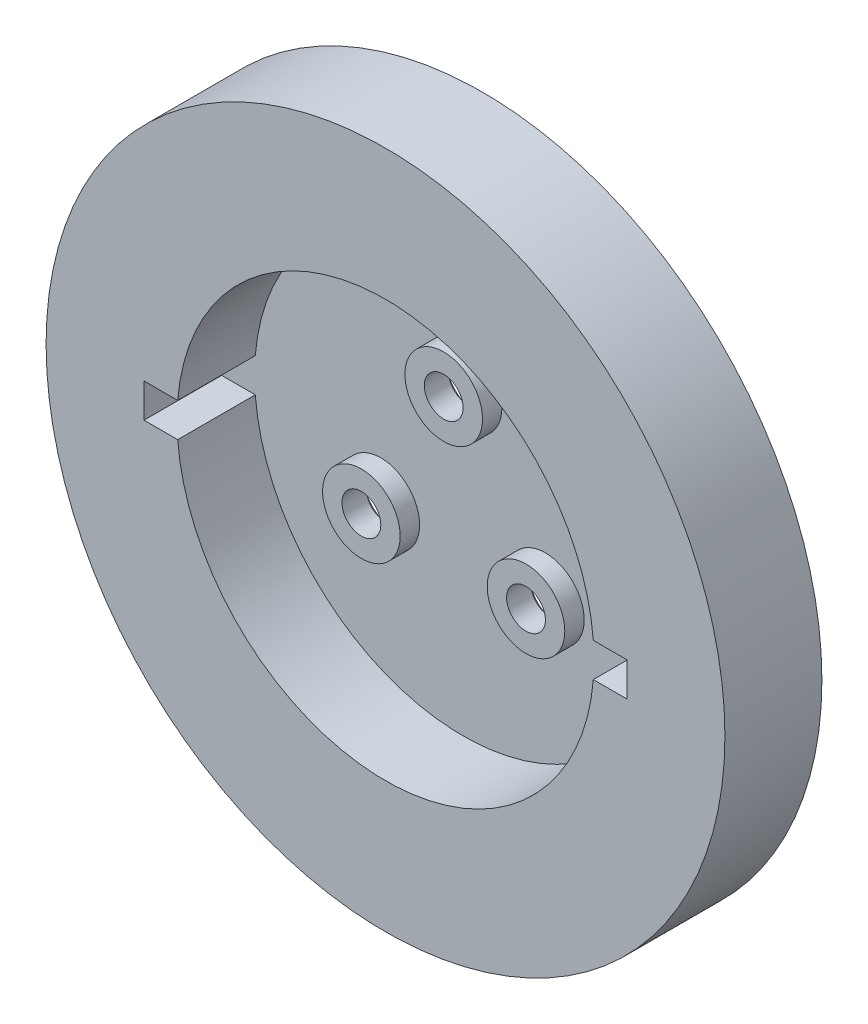
ISO-10303-21;
HEADER;
FILE_DESCRIPTION(('STEP AP214'),'2;1');
FILE_NAME('part.step','',(''),(''),'','','');
FILE_SCHEMA(('AUTOMOTIVE_DESIGN { 1 0 10303 214 1 1 1 1 }'));
ENDSEC;
DATA;
#1=APPLICATION_CONTEXT('core data for automotive mechanical design processes');
#2=APPLICATION_PROTOCOL_DEFINITION('international standard','automotive_design',2000,#1);
#3=PRODUCT_CONTEXT('',#1,'mechanical');
#4=PRODUCT('Part','Part','',(#3));
#5=PRODUCT_RELATED_PRODUCT_CATEGORY('part','',(#4));
#6=PRODUCT_DEFINITION_FORMATION('','',#4);
#7=PRODUCT_DEFINITION_CONTEXT('part definition',#1,'design');
#8=PRODUCT_DEFINITION('design','',#6,#7);
#9=PRODUCT_DEFINITION_SHAPE('','',#8);
#10=(LENGTH_UNIT() NAMED_UNIT(*) SI_UNIT(.MILLI.,.METRE.));
#11=(NAMED_UNIT(*) PLANE_ANGLE_UNIT() SI_UNIT($,.RADIAN.));
#12=(NAMED_UNIT(*) SI_UNIT($,.STERADIAN.) SOLID_ANGLE_UNIT());
#13=UNCERTAINTY_MEASURE_WITH_UNIT(LENGTH_MEASURE(1.E-05),#10,'distance_accuracy_value','');
#14=(GEOMETRIC_REPRESENTATION_CONTEXT(3) GLOBAL_UNCERTAINTY_ASSIGNED_CONTEXT((#13)) GLOBAL_UNIT_ASSIGNED_CONTEXT((#10,
#11,#12)) REPRESENTATION_CONTEXT('',''));
#15=CARTESIAN_POINT('',(0.,0.,0.));
#16=DIRECTION('',(0.,0.,1.));
#17=DIRECTION('',(1.,0.,0.));
#18=AXIS2_PLACEMENT_3D('',#15,#16,#17);
#19=CARTESIAN_POINT('',(0.,0.,2.));
#20=DIRECTION('',(0.,0.,1.));
#21=DIRECTION('',(1.,0.,0.));
#22=AXIS2_PLACEMENT_3D('',#19,#20,#21);
#23=PLANE('',#22);
#24=CARTESIAN_POINT('',(-8.4870489570886,-4.90000000000001,2.));
#25=DIRECTION('',(0.,0.,1.));
#26=DIRECTION('',(1.,0.,0.));
#27=AXIS2_PLACEMENT_3D('',#24,#25,#26);
#28=CIRCLE('',#27,4.);
#29=CARTESIAN_POINT('',(-4.4870489570886,-4.90000000000001,2.));
#30=VERTEX_POINT('',#29);
#31=EDGE_CURVE('E266',#30,#30,#28,.T.);
#32=ORIENTED_EDGE('',*,*,#31,.F.);
#33=EDGE_LOOP('',(#32));
#34=FACE_BOUND('',#33,.T.);
#35=DIRECTION('',(-1.,0.,0.));
#36=VECTOR('',#35,1.);
#37=CARTESIAN_POINT('',(0.,-1.75,2.));
#38=LINE('',#37,#36);
#39=CARTESIAN_POINT('',(24.9,-1.75,2.));
#40=VERTEX_POINT('',#39);
#41=CARTESIAN_POINT('',(21.4286607140997,-1.75,2.));
#42=VERTEX_POINT('',#41);
#43=EDGE_CURVE('E61',#40,#42,#38,.T.);
#44=ORIENTED_EDGE('',*,*,#43,.F.);
#45=DIRECTION('',(0.,1.,0.));
#46=VECTOR('',#45,1.);
#47=CARTESIAN_POINT('',(24.9,0.,2.));
#48=LINE('',#47,#46);
#49=CARTESIAN_POINT('',(24.9,1.75,2.));
#50=VERTEX_POINT('',#49);
#51=EDGE_CURVE('E188',#40,#50,#48,.T.);
#52=ORIENTED_EDGE('',*,*,#51,.T.);
#53=DIRECTION('',(-1.,0.,0.));
#54=VECTOR('',#53,1.);
#55=CARTESIAN_POINT('',(0.,1.75,2.));
#56=LINE('',#55,#54);
#57=CARTESIAN_POINT('',(21.4286607140997,1.75,2.));
#58=VERTEX_POINT('',#57);
#59=EDGE_CURVE('E198',#50,#58,#56,.T.);
#60=ORIENTED_EDGE('',*,*,#59,.T.);
#61=CARTESIAN_POINT('',(0.,0.,2.));
#62=DIRECTION('',(0.,0.,1.));
#63=DIRECTION('',(1.,0.,0.));
#64=AXIS2_PLACEMENT_3D('',#61,#62,#63);
#65=CIRCLE('',#64,21.5);
#66=CARTESIAN_POINT('',(-21.4286607140993,1.74999999999937,2.));
#67=VERTEX_POINT('',#66);
#68=EDGE_CURVE('E138',#58,#67,#65,.T.);
#69=ORIENTED_EDGE('',*,*,#68,.T.);
#70=DIRECTION('',(1.,-2.44241783661828E-13,0.));
#71=VECTOR('',#70,1.);
#72=CARTESIAN_POINT('',(4.27423121406757E-13,1.74999999999409,2.));
#73=LINE('',#72,#71);
#74=CARTESIAN_POINT('',(-24.8999999999991,1.75000000000018,2.));
#75=VERTEX_POINT('',#74);
#76=EDGE_CURVE('E129',#75,#67,#73,.T.);
#77=ORIENTED_EDGE('',*,*,#76,.F.);
#78=DIRECTION('',(4.97617819965918E-13,1.,0.));
#79=VECTOR('',#78,1.);
#80=CARTESIAN_POINT('',(-24.9,1.23906837171513E-11,2.));
#81=LINE('',#80,#79);
#82=CARTESIAN_POINT('',(-24.9,-1.74999999999983,2.));
#83=VERTEX_POINT('',#82);
#84=EDGE_CURVE('E109',#83,#75,#81,.T.);
#85=ORIENTED_EDGE('',*,*,#84,.F.);
#86=DIRECTION('',(1.,-2.43429726580597E-13,0.));
#87=VECTOR('',#86,1.);
#88=CARTESIAN_POINT('',(-4.26002021517478E-13,-1.75000000000589,2.));
#89=LINE('',#88,#87);
#90=CARTESIAN_POINT('',(-21.4286607140997,-1.75000000000067,2.));
#91=VERTEX_POINT('',#90);
#92=EDGE_CURVE('E126',#83,#91,#89,.T.);
#93=ORIENTED_EDGE('',*,*,#92,.T.);
#94=EDGE_CURVE('E134',#91,#42,#65,.T.);
#95=ORIENTED_EDGE('',*,*,#94,.T.);
#96=EDGE_LOOP('',(#44,#52,#60,#69,#77,#85,#93,#95));
#97=FACE_BOUND('',#96,.T.);
#98=CARTESIAN_POINT('',(0.,9.8000000000006,2.));
#99=DIRECTION('',(0.,0.,1.));
#100=DIRECTION('',(1.,0.,0.));
#101=AXIS2_PLACEMENT_3D('',#98,#99,#100);
#102=CIRCLE('',#101,4.);
#103=CARTESIAN_POINT('',(3.99999999999991,9.8000000000006,2.));
#104=VERTEX_POINT('',#103);
#105=EDGE_CURVE('E254',#104,#104,#102,.T.);
#106=ORIENTED_EDGE('',*,*,#105,.F.);
#107=EDGE_LOOP('',(#106));
#108=FACE_BOUND('',#107,.T.);
#109=CARTESIAN_POINT('',(8.48704895708744,-4.90000000000058,2.));
#110=DIRECTION('',(0.,0.,1.));
#111=DIRECTION('',(1.,0.,0.));
#112=AXIS2_PLACEMENT_3D('',#109,#110,#111);
#113=CIRCLE('',#112,4.);
#114=CARTESIAN_POINT('',(12.4870489570874,-4.90000000000058,2.));
#115=VERTEX_POINT('',#114);
#116=EDGE_CURVE('E278',#115,#115,#113,.T.);
#117=ORIENTED_EDGE('',*,*,#116,.F.);
#118=EDGE_LOOP('',(#117));
#119=FACE_BOUND('',#118,.T.);
#120=ADVANCED_FACE('F39',(#34,#97,#108,#119),#23,.T.);
#121=CARTESIAN_POINT('',(0.,0.,10.));
#122=DIRECTION('',(0.,0.,1.));
#123=DIRECTION('',(1.,0.,0.));
#124=AXIS2_PLACEMENT_3D('',#121,#122,#123);
#125=PLANE('',#124);
#126=CARTESIAN_POINT('',(0.,0.,10.));
#127=DIRECTION('',(0.,0.,1.));
#128=DIRECTION('',(1.,0.,0.));
#129=AXIS2_PLACEMENT_3D('',#126,#127,#128);
#130=CIRCLE('',#129,35.);
#131=CARTESIAN_POINT('',(35.,0.,10.));
#132=VERTEX_POINT('',#131);
#133=EDGE_CURVE('E11',#132,#132,#130,.T.);
#134=ORIENTED_EDGE('',*,*,#133,.T.);
#135=EDGE_LOOP('',(#134));
#136=FACE_BOUND('',#135,.T.);
#137=DIRECTION('',(0.,1.,0.));
#138=VECTOR('',#137,1.);
#139=CARTESIAN_POINT('',(24.9,0.,10.));
#140=LINE('',#139,#138);
#141=CARTESIAN_POINT('',(24.9,-1.75,10.));
#142=VERTEX_POINT('',#141);
#143=CARTESIAN_POINT('',(24.9,1.75,10.));
#144=VERTEX_POINT('',#143);
#145=EDGE_CURVE('E143',#142,#144,#140,.T.);
#146=ORIENTED_EDGE('',*,*,#145,.F.);
#147=DIRECTION('',(-1.,0.,0.));
#148=VECTOR('',#147,1.);
#149=CARTESIAN_POINT('',(0.,-1.75,10.));
#150=LINE('',#149,#148);
#151=CARTESIAN_POINT('',(21.4286607140997,-1.75,10.));
#152=VERTEX_POINT('',#151);
#153=EDGE_CURVE('E55',#142,#152,#150,.T.);
#154=ORIENTED_EDGE('',*,*,#153,.T.);
#155=CARTESIAN_POINT('',(0.,0.,10.));
#156=DIRECTION('',(0.,0.,1.));
#157=DIRECTION('',(1.,0.,0.));
#158=AXIS2_PLACEMENT_3D('',#155,#156,#157);
#159=CIRCLE('',#158,21.5);
#160=CARTESIAN_POINT('',(-21.4286607140997,-1.75000000000067,10.));
#161=VERTEX_POINT('',#160);
#162=EDGE_CURVE('E157',#161,#152,#159,.T.);
#163=ORIENTED_EDGE('',*,*,#162,.F.);
#164=DIRECTION('',(1.,-2.43429726580597E-13,0.));
#165=VECTOR('',#164,1.);
#166=CARTESIAN_POINT('',(-4.26002021517478E-13,-1.75000000000589,10.));
#167=LINE('',#166,#165);
#168=CARTESIAN_POINT('',(-24.9,-1.74999999999983,10.));
#169=VERTEX_POINT('',#168);
#170=EDGE_CURVE('E163',#169,#161,#167,.T.);
#171=ORIENTED_EDGE('',*,*,#170,.F.);
#172=DIRECTION('',(4.97617819965918E-13,1.,0.));
#173=VECTOR('',#172,1.);
#174=CARTESIAN_POINT('',(-24.9,1.23906837171513E-11,10.));
#175=LINE('',#174,#173);
#176=CARTESIAN_POINT('',(-24.8999999999991,1.75000000000018,10.));
#177=VERTEX_POINT('',#176);
#178=EDGE_CURVE('E112',#169,#177,#175,.T.);
#179=ORIENTED_EDGE('',*,*,#178,.T.);
#180=DIRECTION('',(1.,-2.44241783661828E-13,0.));
#181=VECTOR('',#180,1.);
#182=CARTESIAN_POINT('',(4.27423121406757E-13,1.74999999999409,10.));
#183=LINE('',#182,#181);
#184=CARTESIAN_POINT('',(-21.4286607140993,1.74999999999937,10.));
#185=VERTEX_POINT('',#184);
#186=EDGE_CURVE('E156',#177,#185,#183,.T.);
#187=ORIENTED_EDGE('',*,*,#186,.T.);
#188=CARTESIAN_POINT('',(21.4286607140997,1.75,10.));
#189=VERTEX_POINT('',#188);
#190=EDGE_CURVE('E152',#189,#185,#159,.T.);
#191=ORIENTED_EDGE('',*,*,#190,.F.);
#192=DIRECTION('',(-1.,0.,0.));
#193=VECTOR('',#192,1.);
#194=CARTESIAN_POINT('',(0.,1.75,10.));
#195=LINE('',#194,#193);
#196=EDGE_CURVE('E148',#144,#189,#195,.T.);
#197=ORIENTED_EDGE('',*,*,#196,.F.);
#198=EDGE_LOOP('',(#146,#154,#163,#171,#179,#187,#191,#197));
#199=FACE_BOUND('',#198,.T.);
#200=ADVANCED_FACE('F190',(#136,#199),#125,.T.);
#201=CARTESIAN_POINT('',(0.,0.,10.));
#202=DIRECTION('',(0.,0.,-1.));
#203=DIRECTION('',(-1.,0.,0.));
#204=AXIS2_PLACEMENT_3D('',#201,#202,#203);
#205=CYLINDRICAL_SURFACE('',#204,35.);
#206=ORIENTED_EDGE('',*,*,#133,.F.);
#207=EDGE_LOOP('',(#206));
#208=FACE_BOUND('',#207,.T.);
#209=CARTESIAN_POINT('',(0.,0.,0.));
#210=DIRECTION('',(0.,0.,1.));
#211=DIRECTION('',(1.,0.,0.));
#212=AXIS2_PLACEMENT_3D('',#209,#210,#211);
#213=CIRCLE('',#212,35.);
#214=CARTESIAN_POINT('',(35.,0.,0.));
#215=VERTEX_POINT('',#214);
#216=EDGE_CURVE('E43',#215,#215,#213,.T.);
#217=ORIENTED_EDGE('',*,*,#216,.T.);
#218=EDGE_LOOP('',(#217));
#219=FACE_BOUND('',#218,.T.);
#220=ADVANCED_FACE('F41',(#208,#219),#205,.T.);
#221=CARTESIAN_POINT('',(0.,0.,0.));
#222=DIRECTION('',(0.,0.,1.));
#223=DIRECTION('',(1.,0.,0.));
#224=AXIS2_PLACEMENT_3D('',#221,#222,#223);
#225=PLANE('',#224);
#226=CARTESIAN_POINT('',(0.,9.8000000000006,0.));
#227=DIRECTION('',(0.,0.,-1.));
#228=DIRECTION('',(-1.,0.,0.));
#229=AXIS2_PLACEMENT_3D('',#226,#227,#228);
#230=CIRCLE('',#229,4.);
#231=CARTESIAN_POINT('',(-4.0000000000001,9.8000000000006,0.));
#232=VERTEX_POINT('',#231);
#233=EDGE_CURVE('E219',#232,#232,#230,.T.);
#234=ORIENTED_EDGE('',*,*,#233,.F.);
#235=EDGE_LOOP('',(#234));
#236=FACE_BOUND('',#235,.T.);
#237=CARTESIAN_POINT('',(8.48704895708804,-4.90000000000026,0.));
#238=DIRECTION('',(0.,0.,-1.));
#239=DIRECTION('',(-1.,0.,0.));
#240=AXIS2_PLACEMENT_3D('',#237,#238,#239);
#241=CIRCLE('',#240,4.);
#242=CARTESIAN_POINT('',(4.48704895708804,-4.90000000000026,0.));
#243=VERTEX_POINT('',#242);
#244=EDGE_CURVE('E227',#243,#243,#241,.T.);
#245=ORIENTED_EDGE('',*,*,#244,.F.);
#246=EDGE_LOOP('',(#245));
#247=FACE_BOUND('',#246,.T.);
#248=CARTESIAN_POINT('',(-8.48704895708802,-4.9000000000003,0.));
#249=DIRECTION('',(0.,0.,-1.));
#250=DIRECTION('',(-1.,0.,0.));
#251=AXIS2_PLACEMENT_3D('',#248,#249,#250);
#252=CIRCLE('',#251,4.);
#253=CARTESIAN_POINT('',(-12.487048957088,-4.9000000000003,0.));
#254=VERTEX_POINT('',#253);
#255=EDGE_CURVE('E235',#254,#254,#252,.T.);
#256=ORIENTED_EDGE('',*,*,#255,.F.);
#257=EDGE_LOOP('',(#256));
#258=FACE_BOUND('',#257,.T.);
#259=ORIENTED_EDGE('',*,*,#216,.F.);
#260=EDGE_LOOP('',(#259));
#261=FACE_BOUND('',#260,.T.);
#262=ADVANCED_FACE('F333',(#236,#247,#258,#261),#225,.F.);
#263=CARTESIAN_POINT('',(0.,-1.75,2.));
#264=DIRECTION('',(0.,1.,0.));
#265=DIRECTION('',(0.,0.,1.));
#266=AXIS2_PLACEMENT_3D('',#263,#264,#265);
#267=PLANE('',#266);
#268=ORIENTED_EDGE('',*,*,#153,.F.);
#269=DIRECTION('',(0.,0.,1.));
#270=VECTOR('',#269,1.);
#271=CARTESIAN_POINT('',(24.9,-1.75,2.));
#272=LINE('',#271,#270);
#273=EDGE_CURVE('E91',#40,#142,#272,.T.);
#274=ORIENTED_EDGE('',*,*,#273,.F.);
#275=ORIENTED_EDGE('',*,*,#43,.T.);
#276=DIRECTION('',(0.,0.,1.));
#277=VECTOR('',#276,1.);
#278=CARTESIAN_POINT('',(21.4286607140997,-1.75,2.));
#279=LINE('',#278,#277);
#280=EDGE_CURVE('E87',#42,#152,#279,.T.);
#281=ORIENTED_EDGE('',*,*,#280,.T.);
#282=EDGE_LOOP('',(#268,#274,#275,#281));
#283=FACE_BOUND('',#282,.T.);
#284=ADVANCED_FACE('F321',(#283),#267,.T.);
#285=CARTESIAN_POINT('',(0.,0.,2.));
#286=DIRECTION('',(0.,0.,1.));
#287=DIRECTION('',(1.,0.,0.));
#288=AXIS2_PLACEMENT_3D('',#285,#286,#287);
#289=CYLINDRICAL_SURFACE('',#288,21.5);
#290=ORIENTED_EDGE('',*,*,#162,.T.);
#291=ORIENTED_EDGE('',*,*,#280,.F.);
#292=ORIENTED_EDGE('',*,*,#94,.F.);
#293=DIRECTION('',(0.,0.,1.));
#294=VECTOR('',#293,1.);
#295=CARTESIAN_POINT('',(-21.4286607140997,-1.75000000000067,2.));
#296=LINE('',#295,#294);
#297=EDGE_CURVE('E118',#91,#161,#296,.T.);
#298=ORIENTED_EDGE('',*,*,#297,.T.);
#299=EDGE_LOOP('',(#290,#291,#292,#298));
#300=FACE_BOUND('',#299,.T.);
#301=ADVANCED_FACE('F318',(#300),#289,.F.);
#302=CARTESIAN_POINT('',(-4.26002021517478E-13,-1.75000000000589,2.));
#303=DIRECTION('',(-2.43429726580597E-13,-1.,0.));
#304=DIRECTION('',(1.,-2.43429726580597E-13,0.));
#305=AXIS2_PLACEMENT_3D('',#302,#303,#304);
#306=PLANE('',#305);
#307=ORIENTED_EDGE('',*,*,#170,.T.);
#308=ORIENTED_EDGE('',*,*,#297,.F.);
#309=ORIENTED_EDGE('',*,*,#92,.F.);
#310=DIRECTION('',(0.,0.,1.));
#311=VECTOR('',#310,1.);
#312=CARTESIAN_POINT('',(-24.9,-1.74999999999983,2.));
#313=LINE('',#312,#311);
#314=EDGE_CURVE('E106',#83,#169,#313,.T.);
#315=ORIENTED_EDGE('',*,*,#314,.T.);
#316=EDGE_LOOP('',(#307,#308,#309,#315));
#317=FACE_BOUND('',#316,.T.);
#318=ADVANCED_FACE('F132',(#317),#306,.F.);
#319=CARTESIAN_POINT('',(-24.9,1.23906837171513E-11,2.));
#320=DIRECTION('',(1.,-4.97617819965918E-13,0.));
#321=DIRECTION('',(4.97617819965918E-13,1.,0.));
#322=AXIS2_PLACEMENT_3D('',#319,#320,#321);
#323=PLANE('',#322);
#324=ORIENTED_EDGE('',*,*,#178,.F.);
#325=ORIENTED_EDGE('',*,*,#314,.F.);
#326=ORIENTED_EDGE('',*,*,#84,.T.);
#327=DIRECTION('',(0.,0.,1.));
#328=VECTOR('',#327,1.);
#329=CARTESIAN_POINT('',(-24.8999999999991,1.75000000000018,2.));
#330=LINE('',#329,#328);
#331=EDGE_CURVE('E119',#75,#177,#330,.T.);
#332=ORIENTED_EDGE('',*,*,#331,.T.);
#333=EDGE_LOOP('',(#324,#325,#326,#332));
#334=FACE_BOUND('',#333,.T.);
#335=ADVANCED_FACE('F108',(#334),#323,.T.);
#336=CARTESIAN_POINT('',(4.27423121406757E-13,1.74999999999409,2.));
#337=DIRECTION('',(-2.44241783661828E-13,-1.,0.));
#338=DIRECTION('',(1.,-2.44241783661828E-13,0.));
#339=AXIS2_PLACEMENT_3D('',#336,#337,#338);
#340=PLANE('',#339);
#341=ORIENTED_EDGE('',*,*,#186,.F.);
#342=ORIENTED_EDGE('',*,*,#331,.F.);
#343=ORIENTED_EDGE('',*,*,#76,.T.);
#344=DIRECTION('',(0.,0.,1.));
#345=VECTOR('',#344,1.);
#346=CARTESIAN_POINT('',(-21.4286607140993,1.74999999999937,2.));
#347=LINE('',#346,#345);
#348=EDGE_CURVE('E172',#67,#185,#347,.T.);
#349=ORIENTED_EDGE('',*,*,#348,.T.);
#350=EDGE_LOOP('',(#341,#342,#343,#349));
#351=FACE_BOUND('',#350,.T.);
#352=ADVANCED_FACE('F211',(#351),#340,.T.);
#353=ORIENTED_EDGE('',*,*,#190,.T.);
#354=ORIENTED_EDGE('',*,*,#348,.F.);
#355=ORIENTED_EDGE('',*,*,#68,.F.);
#356=DIRECTION('',(0.,0.,1.));
#357=VECTOR('',#356,1.);
#358=CARTESIAN_POINT('',(21.4286607140997,1.75,2.));
#359=LINE('',#358,#357);
#360=EDGE_CURVE('E175',#58,#189,#359,.T.);
#361=ORIENTED_EDGE('',*,*,#360,.T.);
#362=EDGE_LOOP('',(#353,#354,#355,#361));
#363=FACE_BOUND('',#362,.T.);
#364=ADVANCED_FACE('F213',(#363),#289,.F.);
#365=CARTESIAN_POINT('',(0.,1.75,2.));
#366=DIRECTION('',(0.,1.,0.));
#367=DIRECTION('',(0.,0.,1.));
#368=AXIS2_PLACEMENT_3D('',#365,#366,#367);
#369=PLANE('',#368);
#370=ORIENTED_EDGE('',*,*,#196,.T.);
#371=ORIENTED_EDGE('',*,*,#360,.F.);
#372=ORIENTED_EDGE('',*,*,#59,.F.);
#373=DIRECTION('',(0.,0.,1.));
#374=VECTOR('',#373,1.);
#375=CARTESIAN_POINT('',(24.9,1.75,2.));
#376=LINE('',#375,#374);
#377=EDGE_CURVE('E178',#50,#144,#376,.T.);
#378=ORIENTED_EDGE('',*,*,#377,.T.);
#379=EDGE_LOOP('',(#370,#371,#372,#378));
#380=FACE_BOUND('',#379,.T.);
#381=ADVANCED_FACE('F194',(#380),#369,.F.);
#382=CARTESIAN_POINT('',(24.9,0.,2.));
#383=DIRECTION('',(1.,0.,0.));
#384=DIRECTION('',(0.,0.,-1.));
#385=AXIS2_PLACEMENT_3D('',#382,#383,#384);
#386=PLANE('',#385);
#387=ORIENTED_EDGE('',*,*,#145,.T.);
#388=ORIENTED_EDGE('',*,*,#377,.F.);
#389=ORIENTED_EDGE('',*,*,#51,.F.);
#390=ORIENTED_EDGE('',*,*,#273,.T.);
#391=EDGE_LOOP('',(#387,#388,#389,#390));
#392=FACE_BOUND('',#391,.T.);
#393=ADVANCED_FACE('F185',(#392),#386,.F.);
#394=CARTESIAN_POINT('',(-8.48704895708802,-4.9000000000003,1.5));
#395=DIRECTION('',(0.,0.,-1.));
#396=DIRECTION('',(-1.,0.,0.));
#397=AXIS2_PLACEMENT_3D('',#394,#395,#396);
#398=CYLINDRICAL_SURFACE('',#397,4.);
#399=CARTESIAN_POINT('',(-8.48704895708802,-4.9000000000003,1.5));
#400=DIRECTION('',(0.,0.,-1.));
#401=DIRECTION('',(-1.,0.,0.));
#402=AXIS2_PLACEMENT_3D('',#399,#400,#401);
#403=CIRCLE('',#402,4.);
#404=CARTESIAN_POINT('',(-12.487048957088,-4.9000000000003,1.5));
#405=VERTEX_POINT('',#404);
#406=EDGE_CURVE('E231',#405,#405,#403,.T.);
#407=ORIENTED_EDGE('',*,*,#406,.F.);
#408=EDGE_LOOP('',(#407));
#409=FACE_BOUND('',#408,.T.);
#410=ORIENTED_EDGE('',*,*,#255,.T.);
#411=EDGE_LOOP('',(#410));
#412=FACE_BOUND('',#411,.T.);
#413=ADVANCED_FACE('F316',(#409,#412),#398,.F.);
#414=CARTESIAN_POINT('',(0.,0.,1.5));
#415=DIRECTION('',(0.,0.,-1.));
#416=DIRECTION('',(-1.,0.,0.));
#417=AXIS2_PLACEMENT_3D('',#414,#415,#416);
#418=PLANE('',#417);
#419=CARTESIAN_POINT('',(-8.4870489570886,-4.90000000000001,1.5));
#420=DIRECTION('',(0.,0.,-1.));
#421=DIRECTION('',(-1.,0.,0.));
#422=AXIS2_PLACEMENT_3D('',#419,#420,#421);
#423=CIRCLE('',#422,2.00000000000054);
#424=CARTESIAN_POINT('',(-10.4870489570891,-4.90000000000001,1.5));
#425=VERTEX_POINT('',#424);
#426=EDGE_CURVE('E246',#425,#425,#423,.T.);
#427=ORIENTED_EDGE('',*,*,#426,.F.);
#428=EDGE_LOOP('',(#427));
#429=FACE_BOUND('',#428,.T.);
#430=ORIENTED_EDGE('',*,*,#406,.T.);
#431=EDGE_LOOP('',(#430));
#432=FACE_BOUND('',#431,.T.);
#433=ADVANCED_FACE('F352',(#429,#432),#418,.T.);
#434=CARTESIAN_POINT('',(8.48704895708804,-4.90000000000026,1.5));
#435=DIRECTION('',(0.,0.,-1.));
#436=DIRECTION('',(-1.,0.,0.));
#437=AXIS2_PLACEMENT_3D('',#434,#435,#436);
#438=CYLINDRICAL_SURFACE('',#437,4.);
#439=CARTESIAN_POINT('',(8.48704895708804,-4.90000000000026,1.5));
#440=DIRECTION('',(0.,0.,-1.));
#441=DIRECTION('',(-1.,0.,0.));
#442=AXIS2_PLACEMENT_3D('',#439,#440,#441);
#443=CIRCLE('',#442,4.);
#444=CARTESIAN_POINT('',(4.48704895708804,-4.90000000000026,1.5));
#445=VERTEX_POINT('',#444);
#446=EDGE_CURVE('E223',#445,#445,#443,.T.);
#447=ORIENTED_EDGE('',*,*,#446,.F.);
#448=EDGE_LOOP('',(#447));
#449=FACE_BOUND('',#448,.T.);
#450=ORIENTED_EDGE('',*,*,#244,.T.);
#451=EDGE_LOOP('',(#450));
#452=FACE_BOUND('',#451,.T.);
#453=ADVANCED_FACE('F357',(#449,#452),#438,.F.);
#454=CARTESIAN_POINT('',(0.,0.,1.5));
#455=DIRECTION('',(0.,0.,-1.));
#456=DIRECTION('',(-1.,0.,0.));
#457=AXIS2_PLACEMENT_3D('',#454,#455,#456);
#458=PLANE('',#457);
#459=CARTESIAN_POINT('',(8.48704895708744,-4.90000000000058,1.5));
#460=DIRECTION('',(0.,0.,-1.));
#461=DIRECTION('',(-1.,0.,0.));
#462=AXIS2_PLACEMENT_3D('',#459,#460,#461);
#463=CIRCLE('',#462,2.00000000000079);
#464=CARTESIAN_POINT('',(6.48704895708665,-4.90000000000058,1.5));
#465=VERTEX_POINT('',#464);
#466=EDGE_CURVE('E242',#465,#465,#463,.T.);
#467=ORIENTED_EDGE('',*,*,#466,.F.);
#468=EDGE_LOOP('',(#467));
#469=FACE_BOUND('',#468,.T.);
#470=ORIENTED_EDGE('',*,*,#446,.T.);
#471=EDGE_LOOP('',(#470));
#472=FACE_BOUND('',#471,.T.);
#473=ADVANCED_FACE('F364',(#469,#472),#458,.T.);
#474=CARTESIAN_POINT('',(0.,9.8000000000006,1.5));
#475=DIRECTION('',(0.,0.,-1.));
#476=DIRECTION('',(-1.,0.,0.));
#477=AXIS2_PLACEMENT_3D('',#474,#475,#476);
#478=CYLINDRICAL_SURFACE('',#477,4.);
#479=CARTESIAN_POINT('',(0.,9.8000000000006,1.5));
#480=DIRECTION('',(0.,0.,-1.));
#481=DIRECTION('',(-1.,0.,0.));
#482=AXIS2_PLACEMENT_3D('',#479,#480,#481);
#483=CIRCLE('',#482,4.);
#484=CARTESIAN_POINT('',(-4.0000000000001,9.8000000000006,1.5));
#485=VERTEX_POINT('',#484);
#486=EDGE_CURVE('E144',#485,#485,#483,.T.);
#487=ORIENTED_EDGE('',*,*,#486,.F.);
#488=EDGE_LOOP('',(#487));
#489=FACE_BOUND('',#488,.T.);
#490=ORIENTED_EDGE('',*,*,#233,.T.);
#491=EDGE_LOOP('',(#490));
#492=FACE_BOUND('',#491,.T.);
#493=ADVANCED_FACE('F371',(#489,#492),#478,.F.);
#494=CARTESIAN_POINT('',(0.,0.,1.5));
#495=DIRECTION('',(0.,0.,-1.));
#496=DIRECTION('',(-1.,0.,0.));
#497=AXIS2_PLACEMENT_3D('',#494,#495,#496);
#498=PLANE('',#497);
#499=CARTESIAN_POINT('',(0.,9.8000000000006,1.5));
#500=DIRECTION('',(0.,0.,-1.));
#501=DIRECTION('',(-1.,0.,0.));
#502=AXIS2_PLACEMENT_3D('',#499,#500,#501);
#503=CIRCLE('',#502,2.);
#504=CARTESIAN_POINT('',(-2.00000000000009,9.8000000000006,1.5));
#505=VERTEX_POINT('',#504);
#506=EDGE_CURVE('E239',#505,#505,#503,.T.);
#507=ORIENTED_EDGE('',*,*,#506,.F.);
#508=EDGE_LOOP('',(#507));
#509=FACE_BOUND('',#508,.T.);
#510=ORIENTED_EDGE('',*,*,#486,.T.);
#511=EDGE_LOOP('',(#510));
#512=FACE_BOUND('',#511,.T.);
#513=ADVANCED_FACE('F375',(#509,#512),#498,.T.);
#514=CARTESIAN_POINT('',(-8.4870489570886,-4.90000000000001,10.));
#515=DIRECTION('',(0.,0.,-1.));
#516=DIRECTION('',(-1.,0.,0.));
#517=AXIS2_PLACEMENT_3D('',#514,#515,#516);
#518=CYLINDRICAL_SURFACE('',#517,2.00000000000054);
#519=ORIENTED_EDGE('',*,*,#426,.T.);
#520=EDGE_LOOP('',(#519));
#521=FACE_BOUND('',#520,.T.);
#522=CARTESIAN_POINT('',(-8.4870489570886,-4.90000000000001,4.));
#523=DIRECTION('',(0.,0.,1.));
#524=DIRECTION('',(1.,0.,0.));
#525=AXIS2_PLACEMENT_3D('',#522,#523,#524);
#526=CIRCLE('',#525,2.);
#527=CARTESIAN_POINT('',(-6.4870489570886,-4.90000000000001,4.));
#528=VERTEX_POINT('',#527);
#529=EDGE_CURVE('E270',#528,#528,#526,.T.);
#530=ORIENTED_EDGE('',*,*,#529,.T.);
#531=EDGE_LOOP('',(#530));
#532=FACE_BOUND('',#531,.T.);
#533=ADVANCED_FACE('F379',(#521,#532),#518,.F.);
#534=CARTESIAN_POINT('',(8.48704895708744,-4.90000000000058,10.));
#535=DIRECTION('',(0.,0.,-1.));
#536=DIRECTION('',(-1.,0.,0.));
#537=AXIS2_PLACEMENT_3D('',#534,#535,#536);
#538=CYLINDRICAL_SURFACE('',#537,2.00000000000079);
#539=ORIENTED_EDGE('',*,*,#466,.T.);
#540=EDGE_LOOP('',(#539));
#541=FACE_BOUND('',#540,.T.);
#542=CARTESIAN_POINT('',(8.48704895708744,-4.90000000000058,4.));
#543=DIRECTION('',(0.,0.,1.));
#544=DIRECTION('',(1.,0.,0.));
#545=AXIS2_PLACEMENT_3D('',#542,#543,#544);
#546=CIRCLE('',#545,2.);
#547=CARTESIAN_POINT('',(10.4870489570874,-4.90000000000058,4.));
#548=VERTEX_POINT('',#547);
#549=EDGE_CURVE('E282',#548,#548,#546,.T.);
#550=ORIENTED_EDGE('',*,*,#549,.T.);
#551=EDGE_LOOP('',(#550));
#552=FACE_BOUND('',#551,.T.);
#553=ADVANCED_FACE('F288',(#541,#552),#538,.F.);
#554=CARTESIAN_POINT('',(0.,9.8000000000006,10.));
#555=DIRECTION('',(0.,0.,-1.));
#556=DIRECTION('',(-1.,0.,0.));
#557=AXIS2_PLACEMENT_3D('',#554,#555,#556);
#558=CYLINDRICAL_SURFACE('',#557,2.);
#559=ORIENTED_EDGE('',*,*,#506,.T.);
#560=EDGE_LOOP('',(#559));
#561=FACE_BOUND('',#560,.T.);
#562=CARTESIAN_POINT('',(0.,9.8000000000006,4.));
#563=DIRECTION('',(0.,0.,1.));
#564=DIRECTION('',(1.,0.,0.));
#565=AXIS2_PLACEMENT_3D('',#562,#563,#564);
#566=CIRCLE('',#565,2.);
#567=CARTESIAN_POINT('',(1.9999999999999,9.8000000000006,4.));
#568=VERTEX_POINT('',#567);
#569=EDGE_CURVE('E258',#568,#568,#566,.T.);
#570=ORIENTED_EDGE('',*,*,#569,.T.);
#571=EDGE_LOOP('',(#570));
#572=FACE_BOUND('',#571,.T.);
#573=ADVANCED_FACE('F386',(#561,#572),#558,.F.);
#574=CARTESIAN_POINT('',(0.,9.8000000000006,4.));
#575=DIRECTION('',(0.,0.,1.));
#576=DIRECTION('',(1.,0.,0.));
#577=AXIS2_PLACEMENT_3D('',#574,#575,#576);
#578=PLANE('',#577);
#579=CARTESIAN_POINT('',(0.,9.8000000000006,4.));
#580=DIRECTION('',(0.,0.,1.));
#581=DIRECTION('',(1.,0.,0.));
#582=AXIS2_PLACEMENT_3D('',#579,#580,#581);
#583=CIRCLE('',#582,4.);
#584=CARTESIAN_POINT('',(3.99999999999991,9.8000000000006,4.));
#585=VERTEX_POINT('',#584);
#586=EDGE_CURVE('E250',#585,#585,#583,.T.);
#587=ORIENTED_EDGE('',*,*,#586,.T.);
#588=EDGE_LOOP('',(#587));
#589=FACE_BOUND('',#588,.T.);
#590=ORIENTED_EDGE('',*,*,#569,.F.);
#591=EDGE_LOOP('',(#590));
#592=FACE_BOUND('',#591,.T.);
#593=ADVANCED_FACE('F390',(#589,#592),#578,.T.);
#594=CARTESIAN_POINT('',(0.,9.8000000000006,4.));
#595=DIRECTION('',(0.,0.,-1.));
#596=DIRECTION('',(-1.,0.,0.));
#597=AXIS2_PLACEMENT_3D('',#594,#595,#596);
#598=CYLINDRICAL_SURFACE('',#597,4.);
#599=ORIENTED_EDGE('',*,*,#586,.F.);
#600=EDGE_LOOP('',(#599));
#601=FACE_BOUND('',#600,.T.);
#602=ORIENTED_EDGE('',*,*,#105,.T.);
#603=EDGE_LOOP('',(#602));
#604=FACE_BOUND('',#603,.T.);
#605=ADVANCED_FACE('F392',(#601,#604),#598,.T.);
#606=CARTESIAN_POINT('',(-8.4870489570886,-4.90000000000001,4.));
#607=DIRECTION('',(0.,0.,1.));
#608=DIRECTION('',(1.,0.,0.));
#609=AXIS2_PLACEMENT_3D('',#606,#607,#608);
#610=PLANE('',#609);
#611=CARTESIAN_POINT('',(-8.4870489570886,-4.90000000000001,4.));
#612=DIRECTION('',(0.,0.,1.));
#613=DIRECTION('',(1.,0.,0.));
#614=AXIS2_PLACEMENT_3D('',#611,#612,#613);
#615=CIRCLE('',#614,4.);
#616=CARTESIAN_POINT('',(-4.4870489570886,-4.90000000000001,4.));
#617=VERTEX_POINT('',#616);
#618=EDGE_CURVE('E262',#617,#617,#615,.T.);
#619=ORIENTED_EDGE('',*,*,#618,.T.);
#620=EDGE_LOOP('',(#619));
#621=FACE_BOUND('',#620,.T.);
#622=ORIENTED_EDGE('',*,*,#529,.F.);
#623=EDGE_LOOP('',(#622));
#624=FACE_BOUND('',#623,.T.);
#625=ADVANCED_FACE('F302',(#621,#624),#610,.T.);
#626=CARTESIAN_POINT('',(-8.4870489570886,-4.90000000000001,4.));
#627=DIRECTION('',(0.,0.,-1.));
#628=DIRECTION('',(-1.,0.,0.));
#629=AXIS2_PLACEMENT_3D('',#626,#627,#628);
#630=CYLINDRICAL_SURFACE('',#629,4.);
#631=ORIENTED_EDGE('',*,*,#618,.F.);
#632=EDGE_LOOP('',(#631));
#633=FACE_BOUND('',#632,.T.);
#634=ORIENTED_EDGE('',*,*,#31,.T.);
#635=EDGE_LOOP('',(#634));
#636=FACE_BOUND('',#635,.T.);
#637=ADVANCED_FACE('F293',(#633,#636),#630,.T.);
#638=CARTESIAN_POINT('',(8.48704895708744,-4.90000000000058,4.));
#639=DIRECTION('',(0.,0.,1.));
#640=DIRECTION('',(1.,0.,0.));
#641=AXIS2_PLACEMENT_3D('',#638,#639,#640);
#642=PLANE('',#641);
#643=CARTESIAN_POINT('',(8.48704895708744,-4.90000000000058,4.));
#644=DIRECTION('',(0.,0.,1.));
#645=DIRECTION('',(1.,0.,0.));
#646=AXIS2_PLACEMENT_3D('',#643,#644,#645);
#647=CIRCLE('',#646,4.);
#648=CARTESIAN_POINT('',(12.4870489570874,-4.90000000000058,4.));
#649=VERTEX_POINT('',#648);
#650=EDGE_CURVE('E274',#649,#649,#647,.T.);
#651=ORIENTED_EDGE('',*,*,#650,.T.);
#652=EDGE_LOOP('',(#651));
#653=FACE_BOUND('',#652,.T.);
#654=ORIENTED_EDGE('',*,*,#549,.F.);
#655=EDGE_LOOP('',(#654));
#656=FACE_BOUND('',#655,.T.);
#657=ADVANCED_FACE('F290',(#653,#656),#642,.T.);
#658=CARTESIAN_POINT('',(8.48704895708744,-4.90000000000058,4.));
#659=DIRECTION('',(0.,0.,-1.));
#660=DIRECTION('',(-1.,0.,0.));
#661=AXIS2_PLACEMENT_3D('',#658,#659,#660);
#662=CYLINDRICAL_SURFACE('',#661,4.);
#663=ORIENTED_EDGE('',*,*,#650,.F.);
#664=EDGE_LOOP('',(#663));
#665=FACE_BOUND('',#664,.T.);
#666=ORIENTED_EDGE('',*,*,#116,.T.);
#667=EDGE_LOOP('',(#666));
#668=FACE_BOUND('',#667,.T.);
#669=ADVANCED_FACE('F292',(#665,#668),#662,.T.);
#670=CLOSED_SHELL('',(#120,#200,#220,#262,#284,#301,#318,#335,#352,#364,#381,#393,#413,#433,
#453,#473,#493,#513,#533,#553,#573,#593,#605,#625,#637,#657,#669));
#671=MANIFOLD_SOLID_BREP('B2',#670);
#672=ADVANCED_BREP_SHAPE_REPRESENTATION('',(#18,#671),#14);
#673=SHAPE_DEFINITION_REPRESENTATION(#9,#672);
ENDSEC;
END-ISO-10303-21;
